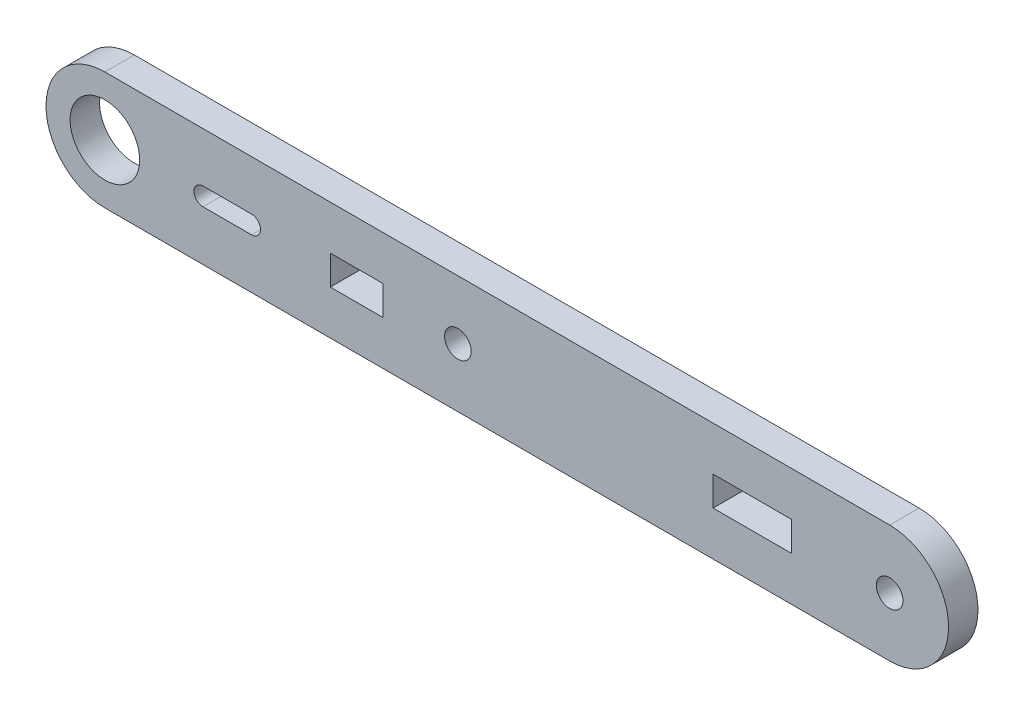
ISO-10303-21;
HEADER;
FILE_DESCRIPTION(('STEP AP214'),'2;1');
FILE_NAME('part.step','',(''),(''),'','','');
FILE_SCHEMA(('AUTOMOTIVE_DESIGN { 1 0 10303 214 1 1 1 1 }'));
ENDSEC;
DATA;
#1=APPLICATION_CONTEXT('core data for automotive mechanical design processes');
#2=APPLICATION_PROTOCOL_DEFINITION('international standard','automotive_design',2000,#1);
#3=PRODUCT_CONTEXT('',#1,'mechanical');
#4=PRODUCT('Part','Part','',(#3));
#5=PRODUCT_RELATED_PRODUCT_CATEGORY('part','',(#4));
#6=PRODUCT_DEFINITION_FORMATION('','',#4);
#7=PRODUCT_DEFINITION_CONTEXT('part definition',#1,'design');
#8=PRODUCT_DEFINITION('design','',#6,#7);
#9=PRODUCT_DEFINITION_SHAPE('','',#8);
#10=(LENGTH_UNIT() NAMED_UNIT(*) SI_UNIT(.MILLI.,.METRE.));
#11=(NAMED_UNIT(*) PLANE_ANGLE_UNIT() SI_UNIT($,.RADIAN.));
#12=(NAMED_UNIT(*) SI_UNIT($,.STERADIAN.) SOLID_ANGLE_UNIT());
#13=UNCERTAINTY_MEASURE_WITH_UNIT(LENGTH_MEASURE(1.E-05),#10,'distance_accuracy_value','');
#14=(GEOMETRIC_REPRESENTATION_CONTEXT(3) GLOBAL_UNCERTAINTY_ASSIGNED_CONTEXT((#13)) GLOBAL_UNIT_ASSIGNED_CONTEXT((#10,
#11,#12)) REPRESENTATION_CONTEXT('',''));
#15=CARTESIAN_POINT('',(0.,0.,0.));
#16=DIRECTION('',(0.,0.,1.));
#17=DIRECTION('',(1.,0.,0.));
#18=AXIS2_PLACEMENT_3D('',#15,#16,#17);
#19=CARTESIAN_POINT('',(-49.3435107871291,6.,-7.20001315512864E-11));
#20=DIRECTION('',(0.,0.,1.));
#21=DIRECTION('',(1.,0.,0.));
#22=AXIS2_PLACEMENT_3D('',#19,#20,#21);
#23=CYLINDRICAL_SURFACE('',#22,6.);
#24=CARTESIAN_POINT('',(-49.3435107871291,6.,3.));
#25=DIRECTION('',(0.,0.,1.));
#26=DIRECTION('',(1.,0.,0.));
#27=AXIS2_PLACEMENT_3D('',#24,#25,#26);
#28=CIRCLE('',#27,6.);
#29=CARTESIAN_POINT('',(-49.3435107871291,12.,3.));
#30=VERTEX_POINT('',#29);
#31=CARTESIAN_POINT('',(-49.3435107871291,0.,3.));
#32=VERTEX_POINT('',#31);
#33=EDGE_CURVE('E261',#30,#32,#28,.T.);
#34=ORIENTED_EDGE('',*,*,#33,.F.);
#35=DIRECTION('',(0.,0.,1.));
#36=VECTOR('',#35,1.);
#37=CARTESIAN_POINT('',(-49.3435107871291,12.,-7.20001315512864E-11));
#38=LINE('',#37,#36);
#39=CARTESIAN_POINT('',(-49.3435107871291,12.,-7.20001315512864E-11));
#40=VERTEX_POINT('',#39);
#41=EDGE_CURVE('E11',#40,#30,#38,.T.);
#42=ORIENTED_EDGE('',*,*,#41,.F.);
#43=CARTESIAN_POINT('',(-49.3435107871291,6.,-7.20001315512864E-11));
#44=DIRECTION('',(0.,0.,1.));
#45=DIRECTION('',(1.,0.,0.));
#46=AXIS2_PLACEMENT_3D('',#43,#44,#45);
#47=CIRCLE('',#46,6.);
#48=CARTESIAN_POINT('',(-49.3435107871291,0.,-7.20001315512864E-11));
#49=VERTEX_POINT('',#48);
#50=EDGE_CURVE('E268',#40,#49,#47,.T.);
#51=ORIENTED_EDGE('',*,*,#50,.T.);
#52=DIRECTION('',(0.,0.,1.));
#53=VECTOR('',#52,1.);
#54=CARTESIAN_POINT('',(-49.3435107871291,0.,-7.20001315512864E-11));
#55=LINE('',#54,#53);
#56=EDGE_CURVE('E39',#49,#32,#55,.T.);
#57=ORIENTED_EDGE('',*,*,#56,.T.);
#58=EDGE_LOOP('',(#34,#42,#51,#57));
#59=FACE_BOUND('',#58,.T.);
#60=ADVANCED_FACE('F36',(#59),#23,.T.);
#61=CARTESIAN_POINT('',(30.6181719329405,12.,-7.20001315512864E-11));
#62=DIRECTION('',(0.,1.,0.));
#63=DIRECTION('',(0.,0.,1.));
#64=AXIS2_PLACEMENT_3D('',#61,#62,#63);
#65=PLANE('',#64);
#66=DIRECTION('',(-1.,0.,0.));
#67=VECTOR('',#66,1.);
#68=CARTESIAN_POINT('',(30.6181719329405,12.,3.));
#69=LINE('',#68,#67);
#70=CARTESIAN_POINT('',(30.6181719329405,12.,3.));
#71=VERTEX_POINT('',#70);
#72=EDGE_CURVE('E272',#71,#30,#69,.T.);
#73=ORIENTED_EDGE('',*,*,#72,.F.);
#74=DIRECTION('',(0.,0.,1.));
#75=VECTOR('',#74,1.);
#76=CARTESIAN_POINT('',(30.6181719329405,12.,-7.20001315512864E-11));
#77=LINE('',#76,#75);
#78=CARTESIAN_POINT('',(30.6181719329405,12.,-7.20001315512864E-11));
#79=VERTEX_POINT('',#78);
#80=EDGE_CURVE('E44',#79,#71,#77,.T.);
#81=ORIENTED_EDGE('',*,*,#80,.F.);
#82=DIRECTION('',(-1.,0.,0.));
#83=VECTOR('',#82,1.);
#84=CARTESIAN_POINT('',(30.6181719329405,12.,-7.20001315512864E-11));
#85=LINE('',#84,#83);
#86=EDGE_CURVE('E278',#79,#40,#85,.T.);
#87=ORIENTED_EDGE('',*,*,#86,.T.);
#88=ORIENTED_EDGE('',*,*,#41,.T.);
#89=EDGE_LOOP('',(#73,#81,#87,#88));
#90=FACE_BOUND('',#89,.T.);
#91=ADVANCED_FACE('F304',(#90),#65,.T.);
#92=CARTESIAN_POINT('',(30.6181719329405,6.,-7.20001315512864E-11));
#93=DIRECTION('',(0.,0.,1.));
#94=DIRECTION('',(1.,0.,0.));
#95=AXIS2_PLACEMENT_3D('',#92,#93,#94);
#96=CYLINDRICAL_SURFACE('',#95,6.);
#97=CARTESIAN_POINT('',(30.6181719329405,6.,3.));
#98=DIRECTION('',(0.,0.,1.));
#99=DIRECTION('',(1.,0.,0.));
#100=AXIS2_PLACEMENT_3D('',#97,#98,#99);
#101=CIRCLE('',#100,6.);
#102=CARTESIAN_POINT('',(30.6181719329405,0.,3.));
#103=VERTEX_POINT('',#102);
#104=EDGE_CURVE('E286',#103,#71,#101,.T.);
#105=ORIENTED_EDGE('',*,*,#104,.F.);
#106=DIRECTION('',(0.,0.,1.));
#107=VECTOR('',#106,1.);
#108=CARTESIAN_POINT('',(30.6181719329405,0.,-7.20001315512864E-11));
#109=LINE('',#108,#107);
#110=CARTESIAN_POINT('',(30.6181719329405,0.,-7.20001315512864E-11));
#111=VERTEX_POINT('',#110);
#112=EDGE_CURVE('E291',#111,#103,#109,.T.);
#113=ORIENTED_EDGE('',*,*,#112,.F.);
#114=CARTESIAN_POINT('',(30.6181719329405,6.,-7.20001315512864E-11));
#115=DIRECTION('',(0.,0.,1.));
#116=DIRECTION('',(1.,0.,0.));
#117=AXIS2_PLACEMENT_3D('',#114,#115,#116);
#118=CIRCLE('',#117,6.);
#119=EDGE_CURVE('E275',#111,#79,#118,.T.);
#120=ORIENTED_EDGE('',*,*,#119,.T.);
#121=ORIENTED_EDGE('',*,*,#80,.T.);
#122=EDGE_LOOP('',(#105,#113,#120,#121));
#123=FACE_BOUND('',#122,.T.);
#124=ADVANCED_FACE('F309',(#123),#96,.T.);
#125=CARTESIAN_POINT('',(-49.3435107871291,0.,-7.20001315512864E-11));
#126=DIRECTION('',(0.,-1.,0.));
#127=DIRECTION('',(0.,0.,-1.));
#128=AXIS2_PLACEMENT_3D('',#125,#126,#127);
#129=PLANE('',#128);
#130=DIRECTION('',(1.,0.,0.));
#131=VECTOR('',#130,1.);
#132=CARTESIAN_POINT('',(-49.3435107871291,0.,3.));
#133=LINE('',#132,#131);
#134=EDGE_CURVE('E283',#32,#103,#133,.T.);
#135=ORIENTED_EDGE('',*,*,#134,.F.);
#136=ORIENTED_EDGE('',*,*,#56,.F.);
#137=DIRECTION('',(1.,0.,0.));
#138=VECTOR('',#137,1.);
#139=CARTESIAN_POINT('',(-49.3435107871291,0.,-7.20001315512864E-11));
#140=LINE('',#139,#138);
#141=EDGE_CURVE('E271',#49,#111,#140,.T.);
#142=ORIENTED_EDGE('',*,*,#141,.T.);
#143=ORIENTED_EDGE('',*,*,#112,.T.);
#144=EDGE_LOOP('',(#135,#136,#142,#143));
#145=FACE_BOUND('',#144,.T.);
#146=ADVANCED_FACE('F299',(#145),#129,.T.);
#147=CARTESIAN_POINT('',(-49.3435107871291,6.,-7.20001315512864E-11));
#148=DIRECTION('',(0.,0.,1.));
#149=DIRECTION('',(1.,0.,0.));
#150=AXIS2_PLACEMENT_3D('',#147,#148,#149);
#151=PLANE('',#150);
#152=DIRECTION('',(1.,0.,0.));
#153=VECTOR('',#152,1.);
#154=CARTESIAN_POINT('',(20.6213066975977,4.4994,-7.20001315512864E-11));
#155=LINE('',#154,#153);
#156=CARTESIAN_POINT('',(12.6221066975976,4.4994,-7.20001315512864E-11));
#157=VERTEX_POINT('',#156);
#158=CARTESIAN_POINT('',(20.6213066975977,4.4994,-7.20001315512864E-11));
#159=VERTEX_POINT('',#158);
#160=EDGE_CURVE('E157',#157,#159,#155,.T.);
#161=ORIENTED_EDGE('',*,*,#160,.T.);
#162=DIRECTION('',(0.,1.,0.));
#163=VECTOR('',#162,1.);
#164=CARTESIAN_POINT('',(20.6213066975977,7.4995,-7.20001315512864E-11));
#165=LINE('',#164,#163);
#166=CARTESIAN_POINT('',(20.6213066975977,7.4995,-7.20001315512864E-11));
#167=VERTEX_POINT('',#166);
#168=EDGE_CURVE('E151',#159,#167,#165,.T.);
#169=ORIENTED_EDGE('',*,*,#168,.T.);
#170=DIRECTION('',(-1.,0.,0.));
#171=VECTOR('',#170,1.);
#172=CARTESIAN_POINT('',(12.6221066975976,7.4995,-7.20001315512864E-11));
#173=LINE('',#172,#171);
#174=CARTESIAN_POINT('',(12.6221066975976,7.4995,-7.20001315512864E-11));
#175=VERTEX_POINT('',#174);
#176=EDGE_CURVE('E160',#167,#175,#173,.T.);
#177=ORIENTED_EDGE('',*,*,#176,.T.);
#178=DIRECTION('',(0.,-1.,0.));
#179=VECTOR('',#178,1.);
#180=CARTESIAN_POINT('',(12.6221066975976,4.4994,-7.20001315512864E-11));
#181=LINE('',#180,#179);
#182=EDGE_CURVE('E52',#175,#157,#181,.T.);
#183=ORIENTED_EDGE('',*,*,#182,.T.);
#184=EDGE_LOOP('',(#161,#169,#177,#183));
#185=FACE_BOUND('',#184,.T.);
#186=CARTESIAN_POINT('',(30.6116066975977,6.0001,-7.20001315512864E-11));
#187=DIRECTION('',(0.,0.,1.));
#188=DIRECTION('',(-1.,0.,0.));
#189=AXIS2_PLACEMENT_3D('',#186,#187,#188);
#190=CIRCLE('',#189,1.35759106374035);
#191=CARTESIAN_POINT('',(31.969197761338,6.0001,-7.20001315512828E-11));
#192=VERTEX_POINT('',#191);
#193=EDGE_CURVE('E186',#192,#192,#190,.T.);
#194=ORIENTED_EDGE('',*,*,#193,.T.);
#195=EDGE_LOOP('',(#194));
#196=FACE_BOUND('',#195,.T.);
#197=CARTESIAN_POINT('',(-13.3753433024024,6.0002,-7.20001315512864E-11));
#198=DIRECTION('',(0.,0.,1.));
#199=DIRECTION('',(-1.,0.,0.));
#200=AXIS2_PLACEMENT_3D('',#197,#198,#199);
#201=CIRCLE('',#200,1.35759106374035);
#202=CARTESIAN_POINT('',(-12.017752238662,6.0002,-7.20001315512828E-11));
#203=VERTEX_POINT('',#202);
#204=EDGE_CURVE('E192',#203,#203,#201,.T.);
#205=ORIENTED_EDGE('',*,*,#204,.T.);
#206=EDGE_LOOP('',(#205));
#207=FACE_BOUND('',#206,.T.);
#208=CARTESIAN_POINT('',(-49.3435107871291,6.,-7.20001315512864E-11));
#209=DIRECTION('',(0.,0.,1.));
#210=DIRECTION('',(-1.,0.,0.));
#211=AXIS2_PLACEMENT_3D('',#208,#209,#210);
#212=CIRCLE('',#211,3.54382579565862);
#213=CARTESIAN_POINT('',(-45.7996849914705,6.,-7.2000131551284E-11));
#214=VERTEX_POINT('',#213);
#215=EDGE_CURVE('E198',#214,#214,#212,.T.);
#216=ORIENTED_EDGE('',*,*,#215,.T.);
#217=EDGE_LOOP('',(#216));
#218=FACE_BOUND('',#217,.T.);
#219=DIRECTION('',(-1.,0.,0.));
#220=VECTOR('',#219,1.);
#221=CARTESIAN_POINT('',(-39.3523475187029,6.93425293544523,-7.20001315512864E-11));
#222=LINE('',#221,#220);
#223=CARTESIAN_POINT('',(-34.4047390861018,6.93425293544523,-7.20001315512864E-11));
#224=VERTEX_POINT('',#223);
#225=CARTESIAN_POINT('',(-39.3523475187029,6.93425293544523,-7.20001315512864E-11));
#226=VERTEX_POINT('',#225);
#227=EDGE_CURVE('E214',#224,#226,#222,.T.);
#228=ORIENTED_EDGE('',*,*,#227,.T.);
#229=CARTESIAN_POINT('',(-39.3523475187029,6.01717646772261,-7.20001315512864E-11));
#230=DIRECTION('',(0.,0.,1.));
#231=DIRECTION('',(-1.,0.,0.));
#232=AXIS2_PLACEMENT_3D('',#229,#230,#231);
#233=CIRCLE('',#232,0.917076467722615);
#234=CARTESIAN_POINT('',(-39.3523475187029,5.1001,-7.20001315512864E-11));
#235=VERTEX_POINT('',#234);
#236=EDGE_CURVE('E204',#226,#235,#233,.T.);
#237=ORIENTED_EDGE('',*,*,#236,.T.);
#238=DIRECTION('',(1.,0.,0.));
#239=VECTOR('',#238,1.);
#240=CARTESIAN_POINT('',(-34.4047390861018,5.1001,-7.20001315512864E-11));
#241=LINE('',#240,#239);
#242=CARTESIAN_POINT('',(-34.4047390861018,5.1001,-7.20001315512864E-11));
#243=VERTEX_POINT('',#242);
#244=EDGE_CURVE('E207',#235,#243,#241,.T.);
#245=ORIENTED_EDGE('',*,*,#244,.T.);
#246=CARTESIAN_POINT('',(-34.4047390861018,6.01717646772261,-7.20001315512864E-11));
#247=DIRECTION('',(0.,0.,1.));
#248=DIRECTION('',(-1.,0.,0.));
#249=AXIS2_PLACEMENT_3D('',#246,#247,#248);
#250=CIRCLE('',#249,0.917076467722615);
#251=EDGE_CURVE('E211',#243,#224,#250,.T.);
#252=ORIENTED_EDGE('',*,*,#251,.T.);
#253=EDGE_LOOP('',(#228,#237,#245,#252));
#254=FACE_BOUND('',#253,.T.);
#255=DIRECTION('',(0.,-1.,0.));
#256=VECTOR('',#255,1.);
#257=CARTESIAN_POINT('',(-26.3777933024023,4.4994,-7.20001315512864E-11));
#258=LINE('',#257,#256);
#259=CARTESIAN_POINT('',(-26.3777933024023,7.4995,-7.20001315512864E-11));
#260=VERTEX_POINT('',#259);
#261=CARTESIAN_POINT('',(-26.3777933024023,4.4994,-7.20001315512864E-11));
#262=VERTEX_POINT('',#261);
#263=EDGE_CURVE('E246',#260,#262,#258,.T.);
#264=ORIENTED_EDGE('',*,*,#263,.T.);
#265=DIRECTION('',(1.,0.,0.));
#266=VECTOR('',#265,1.);
#267=CARTESIAN_POINT('',(-21.0049933024024,4.4994,-7.20001315512864E-11));
#268=LINE('',#267,#266);
#269=CARTESIAN_POINT('',(-21.0049933024024,4.4994,-7.20001315512864E-11));
#270=VERTEX_POINT('',#269);
#271=EDGE_CURVE('E236',#262,#270,#268,.T.);
#272=ORIENTED_EDGE('',*,*,#271,.T.);
#273=DIRECTION('',(0.,1.,0.));
#274=VECTOR('',#273,1.);
#275=CARTESIAN_POINT('',(-21.0049933024024,7.4995,-7.20001315512864E-11));
#276=LINE('',#275,#274);
#277=CARTESIAN_POINT('',(-21.0049933024024,7.4995,-7.20001315512864E-11));
#278=VERTEX_POINT('',#277);
#279=EDGE_CURVE('E239',#270,#278,#276,.T.);
#280=ORIENTED_EDGE('',*,*,#279,.T.);
#281=DIRECTION('',(-1.,0.,0.));
#282=VECTOR('',#281,1.);
#283=CARTESIAN_POINT('',(-26.3777933024023,7.4995,-7.20001315512864E-11));
#284=LINE('',#283,#282);
#285=EDGE_CURVE('E243',#278,#260,#284,.T.);
#286=ORIENTED_EDGE('',*,*,#285,.T.);
#287=EDGE_LOOP('',(#264,#272,#280,#286));
#288=FACE_BOUND('',#287,.T.);
#289=ORIENTED_EDGE('',*,*,#50,.F.);
#290=ORIENTED_EDGE('',*,*,#86,.F.);
#291=ORIENTED_EDGE('',*,*,#119,.F.);
#292=ORIENTED_EDGE('',*,*,#141,.F.);
#293=EDGE_LOOP('',(#289,#290,#291,#292));
#294=FACE_BOUND('',#293,.T.);
#295=ADVANCED_FACE('F164',(#185,#196,#207,#218,#254,#288,#294),#151,.F.);
#296=CARTESIAN_POINT('',(-49.3435107871291,6.,3.));
#297=DIRECTION('',(0.,0.,1.));
#298=DIRECTION('',(1.,0.,0.));
#299=AXIS2_PLACEMENT_3D('',#296,#297,#298);
#300=PLANE('',#299);
#301=DIRECTION('',(0.,1.,0.));
#302=VECTOR('',#301,1.);
#303=CARTESIAN_POINT('',(20.6213066975977,7.4995,3.));
#304=LINE('',#303,#302);
#305=CARTESIAN_POINT('',(20.6213066975977,4.4994,3.));
#306=VERTEX_POINT('',#305);
#307=CARTESIAN_POINT('',(20.6213066975977,7.4995,3.));
#308=VERTEX_POINT('',#307);
#309=EDGE_CURVE('E60',#306,#308,#304,.T.);
#310=ORIENTED_EDGE('',*,*,#309,.F.);
#311=DIRECTION('',(1.,0.,0.));
#312=VECTOR('',#311,1.);
#313=CARTESIAN_POINT('',(20.6213066975977,4.4994,3.));
#314=LINE('',#313,#312);
#315=CARTESIAN_POINT('',(12.6221066975976,4.4994,3.));
#316=VERTEX_POINT('',#315);
#317=EDGE_CURVE('E167',#316,#306,#314,.T.);
#318=ORIENTED_EDGE('',*,*,#317,.F.);
#319=DIRECTION('',(0.,-1.,0.));
#320=VECTOR('',#319,1.);
#321=CARTESIAN_POINT('',(12.6221066975976,4.4994,3.));
#322=LINE('',#321,#320);
#323=CARTESIAN_POINT('',(12.6221066975976,7.4995,3.));
#324=VERTEX_POINT('',#323);
#325=EDGE_CURVE('E170',#324,#316,#322,.T.);
#326=ORIENTED_EDGE('',*,*,#325,.F.);
#327=DIRECTION('',(-1.,0.,0.));
#328=VECTOR('',#327,1.);
#329=CARTESIAN_POINT('',(12.6221066975976,7.4995,3.));
#330=LINE('',#329,#328);
#331=EDGE_CURVE('E176',#308,#324,#330,.T.);
#332=ORIENTED_EDGE('',*,*,#331,.F.);
#333=EDGE_LOOP('',(#310,#318,#326,#332));
#334=FACE_BOUND('',#333,.T.);
#335=CARTESIAN_POINT('',(30.6116066975977,6.0001,3.));
#336=DIRECTION('',(0.,0.,1.));
#337=DIRECTION('',(-1.,0.,0.));
#338=AXIS2_PLACEMENT_3D('',#335,#336,#337);
#339=CIRCLE('',#338,1.35759106374035);
#340=CARTESIAN_POINT('',(31.969197761338,6.0001,3.));
#341=VERTEX_POINT('',#340);
#342=EDGE_CURVE('E182',#341,#341,#339,.T.);
#343=ORIENTED_EDGE('',*,*,#342,.F.);
#344=EDGE_LOOP('',(#343));
#345=FACE_BOUND('',#344,.T.);
#346=CARTESIAN_POINT('',(-13.3753433024024,6.0002,3.));
#347=DIRECTION('',(0.,0.,1.));
#348=DIRECTION('',(-1.,0.,0.));
#349=AXIS2_PLACEMENT_3D('',#346,#347,#348);
#350=CIRCLE('',#349,1.35759106374035);
#351=CARTESIAN_POINT('',(-12.017752238662,6.0002,3.));
#352=VERTEX_POINT('',#351);
#353=EDGE_CURVE('E189',#352,#352,#350,.T.);
#354=ORIENTED_EDGE('',*,*,#353,.F.);
#355=EDGE_LOOP('',(#354));
#356=FACE_BOUND('',#355,.T.);
#357=CARTESIAN_POINT('',(-49.3435107871291,6.,3.));
#358=DIRECTION('',(0.,0.,1.));
#359=DIRECTION('',(-1.,0.,0.));
#360=AXIS2_PLACEMENT_3D('',#357,#358,#359);
#361=CIRCLE('',#360,3.54382579565862);
#362=CARTESIAN_POINT('',(-45.7996849914705,6.,3.));
#363=VERTEX_POINT('',#362);
#364=EDGE_CURVE('E195',#363,#363,#361,.T.);
#365=ORIENTED_EDGE('',*,*,#364,.F.);
#366=EDGE_LOOP('',(#365));
#367=FACE_BOUND('',#366,.T.);
#368=CARTESIAN_POINT('',(-39.3523475187029,6.01717646772261,3.));
#369=DIRECTION('',(0.,0.,1.));
#370=DIRECTION('',(-1.,0.,0.));
#371=AXIS2_PLACEMENT_3D('',#368,#369,#370);
#372=CIRCLE('',#371,0.917076467722615);
#373=CARTESIAN_POINT('',(-39.3523475187029,6.93425293544523,3.));
#374=VERTEX_POINT('',#373);
#375=CARTESIAN_POINT('',(-39.3523475187029,5.1001,3.));
#376=VERTEX_POINT('',#375);
#377=EDGE_CURVE('E201',#374,#376,#372,.T.);
#378=ORIENTED_EDGE('',*,*,#377,.F.);
#379=DIRECTION('',(-1.,0.,0.));
#380=VECTOR('',#379,1.);
#381=CARTESIAN_POINT('',(-39.3523475187029,6.93425293544523,3.));
#382=LINE('',#381,#380);
#383=CARTESIAN_POINT('',(-34.4047390861018,6.93425293544523,3.));
#384=VERTEX_POINT('',#383);
#385=EDGE_CURVE('E208',#384,#374,#382,.T.);
#386=ORIENTED_EDGE('',*,*,#385,.F.);
#387=CARTESIAN_POINT('',(-34.4047390861018,6.01717646772261,3.));
#388=DIRECTION('',(0.,0.,1.));
#389=DIRECTION('',(-1.,0.,0.));
#390=AXIS2_PLACEMENT_3D('',#387,#388,#389);
#391=CIRCLE('',#390,0.917076467722615);
#392=CARTESIAN_POINT('',(-34.4047390861018,5.1001,3.));
#393=VERTEX_POINT('',#392);
#394=EDGE_CURVE('E222',#393,#384,#391,.T.);
#395=ORIENTED_EDGE('',*,*,#394,.F.);
#396=DIRECTION('',(1.,0.,0.));
#397=VECTOR('',#396,1.);
#398=CARTESIAN_POINT('',(-34.4047390861018,5.1001,3.));
#399=LINE('',#398,#397);
#400=EDGE_CURVE('E219',#376,#393,#399,.T.);
#401=ORIENTED_EDGE('',*,*,#400,.F.);
#402=EDGE_LOOP('',(#378,#386,#395,#401));
#403=FACE_BOUND('',#402,.T.);
#404=DIRECTION('',(1.,0.,0.));
#405=VECTOR('',#404,1.);
#406=CARTESIAN_POINT('',(-21.0049933024024,4.4994,3.));
#407=LINE('',#406,#405);
#408=CARTESIAN_POINT('',(-26.3777933024023,4.4994,3.));
#409=VERTEX_POINT('',#408);
#410=CARTESIAN_POINT('',(-21.0049933024024,4.4994,3.));
#411=VERTEX_POINT('',#410);
#412=EDGE_CURVE('E229',#409,#411,#407,.T.);
#413=ORIENTED_EDGE('',*,*,#412,.F.);
#414=DIRECTION('',(0.,-1.,0.));
#415=VECTOR('',#414,1.);
#416=CARTESIAN_POINT('',(-26.3777933024023,4.4994,3.));
#417=LINE('',#416,#415);
#418=CARTESIAN_POINT('',(-26.3777933024023,7.4995,3.));
#419=VERTEX_POINT('',#418);
#420=EDGE_CURVE('E240',#419,#409,#417,.T.);
#421=ORIENTED_EDGE('',*,*,#420,.F.);
#422=DIRECTION('',(-1.,0.,0.));
#423=VECTOR('',#422,1.);
#424=CARTESIAN_POINT('',(-26.3777933024023,7.4995,3.));
#425=LINE('',#424,#423);
#426=CARTESIAN_POINT('',(-21.0049933024024,7.4995,3.));
#427=VERTEX_POINT('',#426);
#428=EDGE_CURVE('E254',#427,#419,#425,.T.);
#429=ORIENTED_EDGE('',*,*,#428,.F.);
#430=DIRECTION('',(0.,1.,0.));
#431=VECTOR('',#430,1.);
#432=CARTESIAN_POINT('',(-21.0049933024024,7.4995,3.));
#433=LINE('',#432,#431);
#434=EDGE_CURVE('E251',#411,#427,#433,.T.);
#435=ORIENTED_EDGE('',*,*,#434,.F.);
#436=EDGE_LOOP('',(#413,#421,#429,#435));
#437=FACE_BOUND('',#436,.T.);
#438=ORIENTED_EDGE('',*,*,#33,.T.);
#439=ORIENTED_EDGE('',*,*,#134,.T.);
#440=ORIENTED_EDGE('',*,*,#104,.T.);
#441=ORIENTED_EDGE('',*,*,#72,.T.);
#442=EDGE_LOOP('',(#438,#439,#440,#441));
#443=FACE_BOUND('',#442,.T.);
#444=ADVANCED_FACE('F301',(#334,#345,#356,#367,#403,#437,#443),#300,.T.);
#445=CARTESIAN_POINT('',(-21.0049933024024,4.4994,-7.20001315512864E-11));
#446=DIRECTION('',(0.,-1.,0.));
#447=DIRECTION('',(0.,0.,-1.));
#448=AXIS2_PLACEMENT_3D('',#445,#446,#447);
#449=PLANE('',#448);
#450=ORIENTED_EDGE('',*,*,#412,.T.);
#451=DIRECTION('',(0.,0.,1.));
#452=VECTOR('',#451,1.);
#453=CARTESIAN_POINT('',(-21.0049933024024,4.4994,-7.20001315512864E-11));
#454=LINE('',#453,#452);
#455=EDGE_CURVE('E249',#270,#411,#454,.T.);
#456=ORIENTED_EDGE('',*,*,#455,.F.);
#457=ORIENTED_EDGE('',*,*,#271,.F.);
#458=DIRECTION('',(0.,0.,1.));
#459=VECTOR('',#458,1.);
#460=CARTESIAN_POINT('',(-26.3777933024023,4.4994,-7.20001315512864E-11));
#461=LINE('',#460,#459);
#462=EDGE_CURVE('E259',#262,#409,#461,.T.);
#463=ORIENTED_EDGE('',*,*,#462,.T.);
#464=EDGE_LOOP('',(#450,#456,#457,#463));
#465=FACE_BOUND('',#464,.T.);
#466=ADVANCED_FACE('F351',(#465),#449,.F.);
#467=CARTESIAN_POINT('',(-26.3777933024023,4.4994,-7.20001315512864E-11));
#468=DIRECTION('',(-1.,0.,0.));
#469=DIRECTION('',(0.,0.,1.));
#470=AXIS2_PLACEMENT_3D('',#467,#468,#469);
#471=PLANE('',#470);
#472=ORIENTED_EDGE('',*,*,#420,.T.);
#473=ORIENTED_EDGE('',*,*,#462,.F.);
#474=ORIENTED_EDGE('',*,*,#263,.F.);
#475=DIRECTION('',(0.,0.,1.));
#476=VECTOR('',#475,1.);
#477=CARTESIAN_POINT('',(-26.3777933024023,7.4995,-7.20001315512864E-11));
#478=LINE('',#477,#476);
#479=EDGE_CURVE('E262',#260,#419,#478,.T.);
#480=ORIENTED_EDGE('',*,*,#479,.T.);
#481=EDGE_LOOP('',(#472,#473,#474,#480));
#482=FACE_BOUND('',#481,.T.);
#483=ADVANCED_FACE('F361',(#482),#471,.F.);
#484=CARTESIAN_POINT('',(-26.3777933024023,7.4995,-7.20001315512864E-11));
#485=DIRECTION('',(0.,1.,0.));
#486=DIRECTION('',(0.,0.,1.));
#487=AXIS2_PLACEMENT_3D('',#484,#485,#486);
#488=PLANE('',#487);
#489=ORIENTED_EDGE('',*,*,#428,.T.);
#490=ORIENTED_EDGE('',*,*,#479,.F.);
#491=ORIENTED_EDGE('',*,*,#285,.F.);
#492=DIRECTION('',(0.,0.,1.));
#493=VECTOR('',#492,1.);
#494=CARTESIAN_POINT('',(-21.0049933024024,7.4995,-7.20001315512864E-11));
#495=LINE('',#494,#493);
#496=EDGE_CURVE('E264',#278,#427,#495,.T.);
#497=ORIENTED_EDGE('',*,*,#496,.T.);
#498=EDGE_LOOP('',(#489,#490,#491,#497));
#499=FACE_BOUND('',#498,.T.);
#500=ADVANCED_FACE('F371',(#499),#488,.F.);
#501=CARTESIAN_POINT('',(-21.0049933024024,7.4995,-7.20001315512864E-11));
#502=DIRECTION('',(1.,0.,0.));
#503=DIRECTION('',(0.,0.,-1.));
#504=AXIS2_PLACEMENT_3D('',#501,#502,#503);
#505=PLANE('',#504);
#506=ORIENTED_EDGE('',*,*,#434,.T.);
#507=ORIENTED_EDGE('',*,*,#496,.F.);
#508=ORIENTED_EDGE('',*,*,#279,.F.);
#509=ORIENTED_EDGE('',*,*,#455,.T.);
#510=EDGE_LOOP('',(#506,#507,#508,#509));
#511=FACE_BOUND('',#510,.T.);
#512=ADVANCED_FACE('F381',(#511),#505,.F.);
#513=CARTESIAN_POINT('',(-39.3523475187029,6.01717646772261,-7.20001315512864E-11));
#514=DIRECTION('',(0.,0.,1.));
#515=DIRECTION('',(1.,0.,0.));
#516=AXIS2_PLACEMENT_3D('',#513,#514,#515);
#517=CYLINDRICAL_SURFACE('',#516,0.917076467722615);
#518=ORIENTED_EDGE('',*,*,#377,.T.);
#519=DIRECTION('',(0.,0.,1.));
#520=VECTOR('',#519,1.);
#521=CARTESIAN_POINT('',(-39.3523475187029,5.1001,-7.20001315512864E-11));
#522=LINE('',#521,#520);
#523=EDGE_CURVE('E217',#235,#376,#522,.T.);
#524=ORIENTED_EDGE('',*,*,#523,.F.);
#525=ORIENTED_EDGE('',*,*,#236,.F.);
#526=DIRECTION('',(0.,0.,1.));
#527=VECTOR('',#526,1.);
#528=CARTESIAN_POINT('',(-39.3523475187029,6.93425293544523,-7.20001315512864E-11));
#529=LINE('',#528,#527);
#530=EDGE_CURVE('E227',#226,#374,#529,.T.);
#531=ORIENTED_EDGE('',*,*,#530,.T.);
#532=EDGE_LOOP('',(#518,#524,#525,#531));
#533=FACE_BOUND('',#532,.T.);
#534=ADVANCED_FACE('F391',(#533),#517,.F.);
#535=CARTESIAN_POINT('',(-39.3523475187029,6.93425293544523,-7.20001315512864E-11));
#536=DIRECTION('',(0.,1.,0.));
#537=DIRECTION('',(0.,0.,1.));
#538=AXIS2_PLACEMENT_3D('',#535,#536,#537);
#539=PLANE('',#538);
#540=ORIENTED_EDGE('',*,*,#385,.T.);
#541=ORIENTED_EDGE('',*,*,#530,.F.);
#542=ORIENTED_EDGE('',*,*,#227,.F.);
#543=DIRECTION('',(0.,0.,1.));
#544=VECTOR('',#543,1.);
#545=CARTESIAN_POINT('',(-34.4047390861018,6.93425293544523,-7.20001315512864E-11));
#546=LINE('',#545,#544);
#547=EDGE_CURVE('E230',#224,#384,#546,.T.);
#548=ORIENTED_EDGE('',*,*,#547,.T.);
#549=EDGE_LOOP('',(#540,#541,#542,#548));
#550=FACE_BOUND('',#549,.T.);
#551=ADVANCED_FACE('F401',(#550),#539,.F.);
#552=CARTESIAN_POINT('',(-34.4047390861018,6.01717646772261,-7.20001315512864E-11));
#553=DIRECTION('',(0.,0.,1.));
#554=DIRECTION('',(1.,0.,0.));
#555=AXIS2_PLACEMENT_3D('',#552,#553,#554);
#556=CYLINDRICAL_SURFACE('',#555,0.917076467722615);
#557=ORIENTED_EDGE('',*,*,#394,.T.);
#558=ORIENTED_EDGE('',*,*,#547,.F.);
#559=ORIENTED_EDGE('',*,*,#251,.F.);
#560=DIRECTION('',(0.,0.,1.));
#561=VECTOR('',#560,1.);
#562=CARTESIAN_POINT('',(-34.4047390861018,5.1001,-7.20001315512864E-11));
#563=LINE('',#562,#561);
#564=EDGE_CURVE('E232',#243,#393,#563,.T.);
#565=ORIENTED_EDGE('',*,*,#564,.T.);
#566=EDGE_LOOP('',(#557,#558,#559,#565));
#567=FACE_BOUND('',#566,.T.);
#568=ADVANCED_FACE('F411',(#567),#556,.F.);
#569=CARTESIAN_POINT('',(-34.4047390861018,5.1001,-7.20001315512864E-11));
#570=DIRECTION('',(0.,-1.,0.));
#571=DIRECTION('',(0.,0.,-1.));
#572=AXIS2_PLACEMENT_3D('',#569,#570,#571);
#573=PLANE('',#572);
#574=ORIENTED_EDGE('',*,*,#400,.T.);
#575=ORIENTED_EDGE('',*,*,#564,.F.);
#576=ORIENTED_EDGE('',*,*,#244,.F.);
#577=ORIENTED_EDGE('',*,*,#523,.T.);
#578=EDGE_LOOP('',(#574,#575,#576,#577));
#579=FACE_BOUND('',#578,.T.);
#580=ADVANCED_FACE('F421',(#579),#573,.F.);
#581=CARTESIAN_POINT('',(-49.3435107871291,6.,-7.20001315512864E-11));
#582=DIRECTION('',(0.,0.,1.));
#583=DIRECTION('',(1.,0.,0.));
#584=AXIS2_PLACEMENT_3D('',#581,#582,#583);
#585=CYLINDRICAL_SURFACE('',#584,3.54382579565862);
#586=CARTESIAN_POINT('',(-45.7996849914705,6.,-7.2000131551284E-11));
#587=CARTESIAN_POINT('',(-45.7996849914705,6.,0.0312499999287499));
#588=CARTESIAN_POINT('',(-45.7996849914705,6.,0.0624999999294999));
#589=CARTESIAN_POINT('',(-45.7996849914705,6.,0.124999999931));
#590=CARTESIAN_POINT('',(-45.7996849914705,6.,0.15624999993175));
#591=CARTESIAN_POINT('',(-45.7996849914705,6.,0.21874999993325));
#592=CARTESIAN_POINT('',(-45.7996849914705,6.,0.249999999934));
#593=CARTESIAN_POINT('',(-45.7996849914705,6.,0.3124999999355));
#594=CARTESIAN_POINT('',(-45.7996849914705,6.,0.34374999993625));
#595=CARTESIAN_POINT('',(-45.7996849914705,6.,0.40624999993775));
#596=CARTESIAN_POINT('',(-45.7996849914705,6.,0.4374999999385));
#597=CARTESIAN_POINT('',(-45.7996849914705,6.,0.49999999994));
#598=CARTESIAN_POINT('',(-45.7996849914705,6.,0.53124999994075));
#599=CARTESIAN_POINT('',(-45.7996849914705,6.,0.59374999994225));
#600=CARTESIAN_POINT('',(-45.7996849914705,6.,0.624999999943));
#601=CARTESIAN_POINT('',(-45.7996849914705,6.,0.6874999999445));
#602=CARTESIAN_POINT('',(-45.7996849914705,6.,0.71874999994525));
#603=CARTESIAN_POINT('',(-45.7996849914705,6.,0.78124999994675));
#604=CARTESIAN_POINT('',(-45.7996849914705,6.,0.8124999999475));
#605=CARTESIAN_POINT('',(-45.7996849914705,6.,0.874999999949));
#606=CARTESIAN_POINT('',(-45.7996849914705,6.,0.90624999994975));
#607=CARTESIAN_POINT('',(-45.7996849914705,6.,0.96874999995125));
#608=CARTESIAN_POINT('',(-45.7996849914705,6.,0.999999999952));
#609=CARTESIAN_POINT('',(-45.7996849914705,6.,1.0624999999535));
#610=CARTESIAN_POINT('',(-45.7996849914705,6.,1.09374999995425));
#611=CARTESIAN_POINT('',(-45.7996849914705,6.,1.15624999995575));
#612=CARTESIAN_POINT('',(-45.7996849914705,6.,1.1874999999565));
#613=CARTESIAN_POINT('',(-45.7996849914705,6.,1.249999999958));
#614=CARTESIAN_POINT('',(-45.7996849914705,6.,1.28124999995875));
#615=CARTESIAN_POINT('',(-45.7996849914705,6.,1.34374999996025));
#616=CARTESIAN_POINT('',(-45.7996849914705,6.,1.374999999961));
#617=CARTESIAN_POINT('',(-45.7996849914705,6.,1.4374999999625));
#618=CARTESIAN_POINT('',(-45.7996849914705,6.,1.46874999996325));
#619=CARTESIAN_POINT('',(-45.7996849914705,6.,1.53124999996475));
#620=CARTESIAN_POINT('',(-45.7996849914705,6.,1.5624999999655));
#621=CARTESIAN_POINT('',(-45.7996849914705,6.,1.624999999967));
#622=CARTESIAN_POINT('',(-45.7996849914705,6.,1.65624999996775));
#623=CARTESIAN_POINT('',(-45.7996849914705,6.,1.71874999996925));
#624=CARTESIAN_POINT('',(-45.7996849914705,6.,1.74999999997));
#625=CARTESIAN_POINT('',(-45.7996849914705,6.,1.8124999999715));
#626=CARTESIAN_POINT('',(-45.7996849914705,6.,1.84374999997225));
#627=CARTESIAN_POINT('',(-45.7996849914705,6.,1.90624999997375));
#628=CARTESIAN_POINT('',(-45.7996849914705,6.,1.9374999999745));
#629=CARTESIAN_POINT('',(-45.7996849914705,6.,1.999999999976));
#630=CARTESIAN_POINT('',(-45.7996849914705,6.,2.03124999997675));
#631=CARTESIAN_POINT('',(-45.7996849914705,6.,2.09374999997825));
#632=CARTESIAN_POINT('',(-45.7996849914705,6.,2.124999999979));
#633=CARTESIAN_POINT('',(-45.7996849914705,6.,2.1874999999805));
#634=CARTESIAN_POINT('',(-45.7996849914705,6.,2.21874999998125));
#635=CARTESIAN_POINT('',(-45.7996849914705,6.,2.28124999998275));
#636=CARTESIAN_POINT('',(-45.7996849914705,6.,2.3124999999835));
#637=CARTESIAN_POINT('',(-45.7996849914705,6.,2.374999999985));
#638=CARTESIAN_POINT('',(-45.7996849914705,6.,2.40624999998575));
#639=CARTESIAN_POINT('',(-45.7996849914705,6.,2.46874999998725));
#640=CARTESIAN_POINT('',(-45.7996849914705,6.,2.499999999988));
#641=CARTESIAN_POINT('',(-45.7996849914705,6.,2.5624999999895));
#642=CARTESIAN_POINT('',(-45.7996849914705,6.,2.59374999999025));
#643=CARTESIAN_POINT('',(-45.7996849914705,6.,2.65624999999175));
#644=CARTESIAN_POINT('',(-45.7996849914705,6.,2.6874999999925));
#645=CARTESIAN_POINT('',(-45.7996849914705,6.,2.749999999994));
#646=CARTESIAN_POINT('',(-45.7996849914705,6.,2.78124999999475));
#647=CARTESIAN_POINT('',(-45.7996849914705,6.,2.84374999999625));
#648=CARTESIAN_POINT('',(-45.7996849914705,6.,2.874999999997));
#649=CARTESIAN_POINT('',(-45.7996849914705,6.,2.9374999999985));
#650=CARTESIAN_POINT('',(-45.7996849914705,6.,2.96874999999925));
#651=CARTESIAN_POINT('',(-45.7996849914705,6.,3.));
#652=B_SPLINE_CURVE_WITH_KNOTS('',3,(#586,#587,#588,#589,#590,#591,#592,#593,#594,#595,#596,
#597,#598,#599,#600,#601,#602,#603,#604,#605,#606,#607,#608,#609,#610,#611,#612,#613,#614,#615,
#616,#617,#618,#619,#620,#621,#622,#623,#624,#625,#626,#627,#628,#629,#630,#631,#632,#633,#634,
#635,#636,#637,#638,#639,#640,#641,#642,#643,#644,#645,#646,#647,#648,#649,#650,#651),
.UNSPECIFIED.,.F.,.F.,(4,2,2,2,2,2,2,2,2,2,2,2,2,2,2,2,2,2,2,2,2,2,2,2,2,2,2,2,2,2,2,2,4),(0.,
0.09375000000225,0.1875000000045,0.28125000000675,0.375000000009,0.46875000001125,
0.5625000000135,0.65625000001575,0.750000000018,0.84375000002025,0.9375000000225,
1.03125000002475,1.125000000027,1.21875000002925,1.3125000000315,1.40625000003375,
1.500000000036,1.59375000003825,1.6875000000405,1.78125000004275,1.875000000045,
1.96875000004725,2.0625000000495,2.15625000005175,2.250000000054,2.34375000005625,
2.4375000000585,2.53125000006075,2.625000000063,2.71875000006525,2.8125000000675,
2.90625000006975,3.000000000072),.UNSPECIFIED.);
#653=EDGE_CURVE('BSEAM431',#214,#363,#652,.T.);
#654=ORIENTED_EDGE('',*,*,#215,.F.);
#655=ORIENTED_EDGE('',*,*,#364,.T.);
#656=ORIENTED_EDGE('',*,*,#653,.T.);
#657=ORIENTED_EDGE('',*,*,#653,.F.);
#658=EDGE_LOOP('',(#654,#656,#655,#657));
#659=FACE_BOUND('',#658,.T.);
#660=ADVANCED_FACE('F431',(#659),#585,.F.);
#661=CARTESIAN_POINT('',(-13.3753433024024,6.0002,-7.20001315512864E-11));
#662=DIRECTION('',(0.,0.,1.));
#663=DIRECTION('',(1.,0.,0.));
#664=AXIS2_PLACEMENT_3D('',#661,#662,#663);
#665=CYLINDRICAL_SURFACE('',#664,1.35759106374035);
#666=CARTESIAN_POINT('',(-12.017752238662,6.0002,-7.20001315512828E-11));
#667=CARTESIAN_POINT('',(-12.017752238662,6.0002,0.0312499999287499));
#668=CARTESIAN_POINT('',(-12.017752238662,6.0002,0.0624999999294999));
#669=CARTESIAN_POINT('',(-12.017752238662,6.0002,0.124999999931));
#670=CARTESIAN_POINT('',(-12.017752238662,6.0002,0.15624999993175));
#671=CARTESIAN_POINT('',(-12.017752238662,6.0002,0.21874999993325));
#672=CARTESIAN_POINT('',(-12.017752238662,6.0002,0.249999999934));
#673=CARTESIAN_POINT('',(-12.017752238662,6.0002,0.3124999999355));
#674=CARTESIAN_POINT('',(-12.017752238662,6.0002,0.34374999993625));
#675=CARTESIAN_POINT('',(-12.017752238662,6.0002,0.40624999993775));
#676=CARTESIAN_POINT('',(-12.017752238662,6.0002,0.4374999999385));
#677=CARTESIAN_POINT('',(-12.017752238662,6.0002,0.49999999994));
#678=CARTESIAN_POINT('',(-12.017752238662,6.0002,0.53124999994075));
#679=CARTESIAN_POINT('',(-12.017752238662,6.0002,0.59374999994225));
#680=CARTESIAN_POINT('',(-12.017752238662,6.0002,0.624999999943));
#681=CARTESIAN_POINT('',(-12.017752238662,6.0002,0.6874999999445));
#682=CARTESIAN_POINT('',(-12.017752238662,6.0002,0.71874999994525));
#683=CARTESIAN_POINT('',(-12.017752238662,6.0002,0.78124999994675));
#684=CARTESIAN_POINT('',(-12.017752238662,6.0002,0.8124999999475));
#685=CARTESIAN_POINT('',(-12.017752238662,6.0002,0.874999999949));
#686=CARTESIAN_POINT('',(-12.017752238662,6.0002,0.90624999994975));
#687=CARTESIAN_POINT('',(-12.017752238662,6.0002,0.96874999995125));
#688=CARTESIAN_POINT('',(-12.017752238662,6.0002,0.999999999952));
#689=CARTESIAN_POINT('',(-12.017752238662,6.0002,1.0624999999535));
#690=CARTESIAN_POINT('',(-12.017752238662,6.0002,1.09374999995425));
#691=CARTESIAN_POINT('',(-12.017752238662,6.0002,1.15624999995575));
#692=CARTESIAN_POINT('',(-12.017752238662,6.0002,1.1874999999565));
#693=CARTESIAN_POINT('',(-12.017752238662,6.0002,1.249999999958));
#694=CARTESIAN_POINT('',(-12.017752238662,6.0002,1.28124999995875));
#695=CARTESIAN_POINT('',(-12.017752238662,6.0002,1.34374999996025));
#696=CARTESIAN_POINT('',(-12.017752238662,6.0002,1.374999999961));
#697=CARTESIAN_POINT('',(-12.017752238662,6.0002,1.4374999999625));
#698=CARTESIAN_POINT('',(-12.017752238662,6.0002,1.46874999996325));
#699=CARTESIAN_POINT('',(-12.017752238662,6.0002,1.53124999996475));
#700=CARTESIAN_POINT('',(-12.017752238662,6.0002,1.5624999999655));
#701=CARTESIAN_POINT('',(-12.017752238662,6.0002,1.624999999967));
#702=CARTESIAN_POINT('',(-12.017752238662,6.0002,1.65624999996775));
#703=CARTESIAN_POINT('',(-12.017752238662,6.0002,1.71874999996925));
#704=CARTESIAN_POINT('',(-12.017752238662,6.0002,1.74999999997));
#705=CARTESIAN_POINT('',(-12.017752238662,6.0002,1.8124999999715));
#706=CARTESIAN_POINT('',(-12.017752238662,6.0002,1.84374999997225));
#707=CARTESIAN_POINT('',(-12.017752238662,6.0002,1.90624999997375));
#708=CARTESIAN_POINT('',(-12.017752238662,6.0002,1.9374999999745));
#709=CARTESIAN_POINT('',(-12.017752238662,6.0002,1.999999999976));
#710=CARTESIAN_POINT('',(-12.017752238662,6.0002,2.03124999997675));
#711=CARTESIAN_POINT('',(-12.017752238662,6.0002,2.09374999997825));
#712=CARTESIAN_POINT('',(-12.017752238662,6.0002,2.124999999979));
#713=CARTESIAN_POINT('',(-12.017752238662,6.0002,2.1874999999805));
#714=CARTESIAN_POINT('',(-12.017752238662,6.0002,2.21874999998125));
#715=CARTESIAN_POINT('',(-12.017752238662,6.0002,2.28124999998275));
#716=CARTESIAN_POINT('',(-12.017752238662,6.0002,2.3124999999835));
#717=CARTESIAN_POINT('',(-12.017752238662,6.0002,2.374999999985));
#718=CARTESIAN_POINT('',(-12.017752238662,6.0002,2.40624999998575));
#719=CARTESIAN_POINT('',(-12.017752238662,6.0002,2.46874999998725));
#720=CARTESIAN_POINT('',(-12.017752238662,6.0002,2.499999999988));
#721=CARTESIAN_POINT('',(-12.017752238662,6.0002,2.5624999999895));
#722=CARTESIAN_POINT('',(-12.017752238662,6.0002,2.59374999999025));
#723=CARTESIAN_POINT('',(-12.017752238662,6.0002,2.65624999999175));
#724=CARTESIAN_POINT('',(-12.017752238662,6.0002,2.6874999999925));
#725=CARTESIAN_POINT('',(-12.017752238662,6.0002,2.749999999994));
#726=CARTESIAN_POINT('',(-12.017752238662,6.0002,2.78124999999475));
#727=CARTESIAN_POINT('',(-12.017752238662,6.0002,2.84374999999625));
#728=CARTESIAN_POINT('',(-12.017752238662,6.0002,2.874999999997));
#729=CARTESIAN_POINT('',(-12.017752238662,6.0002,2.9374999999985));
#730=CARTESIAN_POINT('',(-12.017752238662,6.0002,2.96874999999925));
#731=CARTESIAN_POINT('',(-12.017752238662,6.0002,3.));
#732=B_SPLINE_CURVE_WITH_KNOTS('',3,(#666,#667,#668,#669,#670,#671,#672,#673,#674,#675,#676,
#677,#678,#679,#680,#681,#682,#683,#684,#685,#686,#687,#688,#689,#690,#691,#692,#693,#694,#695,
#696,#697,#698,#699,#700,#701,#702,#703,#704,#705,#706,#707,#708,#709,#710,#711,#712,#713,#714,
#715,#716,#717,#718,#719,#720,#721,#722,#723,#724,#725,#726,#727,#728,#729,#730,#731),
.UNSPECIFIED.,.F.,.F.,(4,2,2,2,2,2,2,2,2,2,2,2,2,2,2,2,2,2,2,2,2,2,2,2,2,2,2,2,2,2,2,2,4),(0.,
0.09375000000225,0.1875000000045,0.28125000000675,0.375000000009,0.46875000001125,
0.5625000000135,0.65625000001575,0.750000000018,0.84375000002025,0.9375000000225,
1.03125000002475,1.125000000027,1.21875000002925,1.3125000000315,1.40625000003375,
1.500000000036,1.59375000003825,1.6875000000405,1.78125000004275,1.875000000045,
1.96875000004725,2.0625000000495,2.15625000005175,2.250000000054,2.34375000005625,
2.4375000000585,2.53125000006075,2.625000000063,2.71875000006525,2.8125000000675,
2.90625000006975,3.000000000072),.UNSPECIFIED.);
#733=EDGE_CURVE('BSEAM441',#203,#352,#732,.T.);
#734=ORIENTED_EDGE('',*,*,#204,.F.);
#735=ORIENTED_EDGE('',*,*,#353,.T.);
#736=ORIENTED_EDGE('',*,*,#733,.T.);
#737=ORIENTED_EDGE('',*,*,#733,.F.);
#738=EDGE_LOOP('',(#734,#736,#735,#737));
#739=FACE_BOUND('',#738,.T.);
#740=ADVANCED_FACE('F441',(#739),#665,.F.);
#741=CARTESIAN_POINT('',(30.6116066975977,6.0001,-7.20001315512864E-11));
#742=DIRECTION('',(0.,0.,1.));
#743=DIRECTION('',(1.,0.,0.));
#744=AXIS2_PLACEMENT_3D('',#741,#742,#743);
#745=CYLINDRICAL_SURFACE('',#744,1.35759106374035);
#746=CARTESIAN_POINT('',(31.969197761338,6.0001,-7.20001315512828E-11));
#747=CARTESIAN_POINT('',(31.969197761338,6.0001,0.0312499999287499));
#748=CARTESIAN_POINT('',(31.969197761338,6.0001,0.0624999999294999));
#749=CARTESIAN_POINT('',(31.969197761338,6.0001,0.124999999931));
#750=CARTESIAN_POINT('',(31.969197761338,6.0001,0.15624999993175));
#751=CARTESIAN_POINT('',(31.969197761338,6.0001,0.21874999993325));
#752=CARTESIAN_POINT('',(31.969197761338,6.0001,0.249999999934));
#753=CARTESIAN_POINT('',(31.969197761338,6.0001,0.3124999999355));
#754=CARTESIAN_POINT('',(31.969197761338,6.0001,0.34374999993625));
#755=CARTESIAN_POINT('',(31.969197761338,6.0001,0.40624999993775));
#756=CARTESIAN_POINT('',(31.969197761338,6.0001,0.4374999999385));
#757=CARTESIAN_POINT('',(31.969197761338,6.0001,0.49999999994));
#758=CARTESIAN_POINT('',(31.969197761338,6.0001,0.53124999994075));
#759=CARTESIAN_POINT('',(31.969197761338,6.0001,0.59374999994225));
#760=CARTESIAN_POINT('',(31.969197761338,6.0001,0.624999999943));
#761=CARTESIAN_POINT('',(31.969197761338,6.0001,0.6874999999445));
#762=CARTESIAN_POINT('',(31.969197761338,6.0001,0.71874999994525));
#763=CARTESIAN_POINT('',(31.969197761338,6.0001,0.78124999994675));
#764=CARTESIAN_POINT('',(31.969197761338,6.0001,0.8124999999475));
#765=CARTESIAN_POINT('',(31.969197761338,6.0001,0.874999999949));
#766=CARTESIAN_POINT('',(31.969197761338,6.0001,0.90624999994975));
#767=CARTESIAN_POINT('',(31.969197761338,6.0001,0.96874999995125));
#768=CARTESIAN_POINT('',(31.969197761338,6.0001,0.999999999952));
#769=CARTESIAN_POINT('',(31.969197761338,6.0001,1.0624999999535));
#770=CARTESIAN_POINT('',(31.969197761338,6.0001,1.09374999995425));
#771=CARTESIAN_POINT('',(31.969197761338,6.0001,1.15624999995575));
#772=CARTESIAN_POINT('',(31.969197761338,6.0001,1.1874999999565));
#773=CARTESIAN_POINT('',(31.969197761338,6.0001,1.249999999958));
#774=CARTESIAN_POINT('',(31.969197761338,6.0001,1.28124999995875));
#775=CARTESIAN_POINT('',(31.969197761338,6.0001,1.34374999996025));
#776=CARTESIAN_POINT('',(31.969197761338,6.0001,1.374999999961));
#777=CARTESIAN_POINT('',(31.969197761338,6.0001,1.4374999999625));
#778=CARTESIAN_POINT('',(31.969197761338,6.0001,1.46874999996325));
#779=CARTESIAN_POINT('',(31.969197761338,6.0001,1.53124999996475));
#780=CARTESIAN_POINT('',(31.969197761338,6.0001,1.5624999999655));
#781=CARTESIAN_POINT('',(31.969197761338,6.0001,1.624999999967));
#782=CARTESIAN_POINT('',(31.969197761338,6.0001,1.65624999996775));
#783=CARTESIAN_POINT('',(31.969197761338,6.0001,1.71874999996925));
#784=CARTESIAN_POINT('',(31.969197761338,6.0001,1.74999999997));
#785=CARTESIAN_POINT('',(31.969197761338,6.0001,1.8124999999715));
#786=CARTESIAN_POINT('',(31.969197761338,6.0001,1.84374999997225));
#787=CARTESIAN_POINT('',(31.969197761338,6.0001,1.90624999997375));
#788=CARTESIAN_POINT('',(31.969197761338,6.0001,1.9374999999745));
#789=CARTESIAN_POINT('',(31.969197761338,6.0001,1.999999999976));
#790=CARTESIAN_POINT('',(31.969197761338,6.0001,2.03124999997675));
#791=CARTESIAN_POINT('',(31.969197761338,6.0001,2.09374999997825));
#792=CARTESIAN_POINT('',(31.969197761338,6.0001,2.124999999979));
#793=CARTESIAN_POINT('',(31.969197761338,6.0001,2.1874999999805));
#794=CARTESIAN_POINT('',(31.969197761338,6.0001,2.21874999998125));
#795=CARTESIAN_POINT('',(31.969197761338,6.0001,2.28124999998275));
#796=CARTESIAN_POINT('',(31.969197761338,6.0001,2.3124999999835));
#797=CARTESIAN_POINT('',(31.969197761338,6.0001,2.374999999985));
#798=CARTESIAN_POINT('',(31.969197761338,6.0001,2.40624999998575));
#799=CARTESIAN_POINT('',(31.969197761338,6.0001,2.46874999998725));
#800=CARTESIAN_POINT('',(31.969197761338,6.0001,2.499999999988));
#801=CARTESIAN_POINT('',(31.969197761338,6.0001,2.5624999999895));
#802=CARTESIAN_POINT('',(31.969197761338,6.0001,2.59374999999025));
#803=CARTESIAN_POINT('',(31.969197761338,6.0001,2.65624999999175));
#804=CARTESIAN_POINT('',(31.969197761338,6.0001,2.6874999999925));
#805=CARTESIAN_POINT('',(31.969197761338,6.0001,2.749999999994));
#806=CARTESIAN_POINT('',(31.969197761338,6.0001,2.78124999999475));
#807=CARTESIAN_POINT('',(31.969197761338,6.0001,2.84374999999625));
#808=CARTESIAN_POINT('',(31.969197761338,6.0001,2.874999999997));
#809=CARTESIAN_POINT('',(31.969197761338,6.0001,2.9374999999985));
#810=CARTESIAN_POINT('',(31.969197761338,6.0001,2.96874999999925));
#811=CARTESIAN_POINT('',(31.969197761338,6.0001,3.));
#812=B_SPLINE_CURVE_WITH_KNOTS('',3,(#746,#747,#748,#749,#750,#751,#752,#753,#754,#755,#756,
#757,#758,#759,#760,#761,#762,#763,#764,#765,#766,#767,#768,#769,#770,#771,#772,#773,#774,#775,
#776,#777,#778,#779,#780,#781,#782,#783,#784,#785,#786,#787,#788,#789,#790,#791,#792,#793,#794,
#795,#796,#797,#798,#799,#800,#801,#802,#803,#804,#805,#806,#807,#808,#809,#810,#811),
.UNSPECIFIED.,.F.,.F.,(4,2,2,2,2,2,2,2,2,2,2,2,2,2,2,2,2,2,2,2,2,2,2,2,2,2,2,2,2,2,2,2,4),(0.,
0.09375000000225,0.1875000000045,0.28125000000675,0.375000000009,0.46875000001125,
0.5625000000135,0.65625000001575,0.750000000018,0.84375000002025,0.9375000000225,
1.03125000002475,1.125000000027,1.21875000002925,1.3125000000315,1.40625000003375,
1.500000000036,1.59375000003825,1.6875000000405,1.78125000004275,1.875000000045,
1.96875000004725,2.0625000000495,2.15625000005175,2.250000000054,2.34375000005625,
2.4375000000585,2.53125000006075,2.625000000063,2.71875000006525,2.8125000000675,
2.90625000006975,3.000000000072),.UNSPECIFIED.);
#813=EDGE_CURVE('BSEAM451',#192,#341,#812,.T.);
#814=ORIENTED_EDGE('',*,*,#193,.F.);
#815=ORIENTED_EDGE('',*,*,#342,.T.);
#816=ORIENTED_EDGE('',*,*,#813,.T.);
#817=ORIENTED_EDGE('',*,*,#813,.F.);
#818=EDGE_LOOP('',(#814,#816,#815,#817));
#819=FACE_BOUND('',#818,.T.);
#820=ADVANCED_FACE('F451',(#819),#745,.F.);
#821=CARTESIAN_POINT('',(20.6213066975977,7.4995,-7.20001315512864E-11));
#822=DIRECTION('',(1.,0.,0.));
#823=DIRECTION('',(0.,0.,-1.));
#824=AXIS2_PLACEMENT_3D('',#821,#822,#823);
#825=PLANE('',#824);
#826=ORIENTED_EDGE('',*,*,#309,.T.);
#827=DIRECTION('',(0.,0.,1.));
#828=VECTOR('',#827,1.);
#829=CARTESIAN_POINT('',(20.6213066975977,7.4995,-7.20001315512864E-11));
#830=LINE('',#829,#828);
#831=EDGE_CURVE('E147',#167,#308,#830,.T.);
#832=ORIENTED_EDGE('',*,*,#831,.F.);
#833=ORIENTED_EDGE('',*,*,#168,.F.);
#834=DIRECTION('',(0.,0.,1.));
#835=VECTOR('',#834,1.);
#836=CARTESIAN_POINT('',(20.6213066975977,4.4994,-7.20001315512864E-11));
#837=LINE('',#836,#835);
#838=EDGE_CURVE('E180',#159,#306,#837,.T.);
#839=ORIENTED_EDGE('',*,*,#838,.T.);
#840=EDGE_LOOP('',(#826,#832,#833,#839));
#841=FACE_BOUND('',#840,.T.);
#842=ADVANCED_FACE('F149',(#841),#825,.F.);
#843=CARTESIAN_POINT('',(20.6213066975977,4.4994,-7.20001315512864E-11));
#844=DIRECTION('',(0.,-1.,0.));
#845=DIRECTION('',(0.,0.,-1.));
#846=AXIS2_PLACEMENT_3D('',#843,#844,#845);
#847=PLANE('',#846);
#848=ORIENTED_EDGE('',*,*,#317,.T.);
#849=ORIENTED_EDGE('',*,*,#838,.F.);
#850=ORIENTED_EDGE('',*,*,#160,.F.);
#851=DIRECTION('',(0.,0.,1.));
#852=VECTOR('',#851,1.);
#853=CARTESIAN_POINT('',(12.6221066975976,4.4994,-7.20001315512864E-11));
#854=LINE('',#853,#852);
#855=EDGE_CURVE('E183',#157,#316,#854,.T.);
#856=ORIENTED_EDGE('',*,*,#855,.T.);
#857=EDGE_LOOP('',(#848,#849,#850,#856));
#858=FACE_BOUND('',#857,.T.);
#859=ADVANCED_FACE('F470',(#858),#847,.F.);
#860=CARTESIAN_POINT('',(12.6221066975976,4.4994,-7.20001315512864E-11));
#861=DIRECTION('',(-1.,0.,0.));
#862=DIRECTION('',(0.,0.,1.));
#863=AXIS2_PLACEMENT_3D('',#860,#861,#862);
#864=PLANE('',#863);
#865=ORIENTED_EDGE('',*,*,#325,.T.);
#866=ORIENTED_EDGE('',*,*,#855,.F.);
#867=ORIENTED_EDGE('',*,*,#182,.F.);
#868=DIRECTION('',(0.,0.,1.));
#869=VECTOR('',#868,1.);
#870=CARTESIAN_POINT('',(12.6221066975976,7.4995,-7.20001315512864E-11));
#871=LINE('',#870,#869);
#872=EDGE_CURVE('E156',#175,#324,#871,.T.);
#873=ORIENTED_EDGE('',*,*,#872,.T.);
#874=EDGE_LOOP('',(#865,#866,#867,#873));
#875=FACE_BOUND('',#874,.T.);
#876=ADVANCED_FACE('F479',(#875),#864,.F.);
#877=CARTESIAN_POINT('',(12.6221066975976,7.4995,-7.20001315512864E-11));
#878=DIRECTION('',(0.,1.,0.));
#879=DIRECTION('',(0.,0.,1.));
#880=AXIS2_PLACEMENT_3D('',#877,#878,#879);
#881=PLANE('',#880);
#882=ORIENTED_EDGE('',*,*,#331,.T.);
#883=ORIENTED_EDGE('',*,*,#872,.F.);
#884=ORIENTED_EDGE('',*,*,#176,.F.);
#885=ORIENTED_EDGE('',*,*,#831,.T.);
#886=EDGE_LOOP('',(#882,#883,#884,#885));
#887=FACE_BOUND('',#886,.T.);
#888=ADVANCED_FACE('F161',(#887),#881,.F.);
#889=CLOSED_SHELL('',(#60,#91,#124,#146,#295,#444,#466,#483,#500,#512,#534,#551,#568,#580,#660,
#740,#820,#842,#859,#876,#888));
#890=MANIFOLD_SOLID_BREP('B2',#889);
#891=ADVANCED_BREP_SHAPE_REPRESENTATION('',(#18,#890),#14);
#892=SHAPE_DEFINITION_REPRESENTATION(#9,#891);
ENDSEC;
END-ISO-10303-21;
